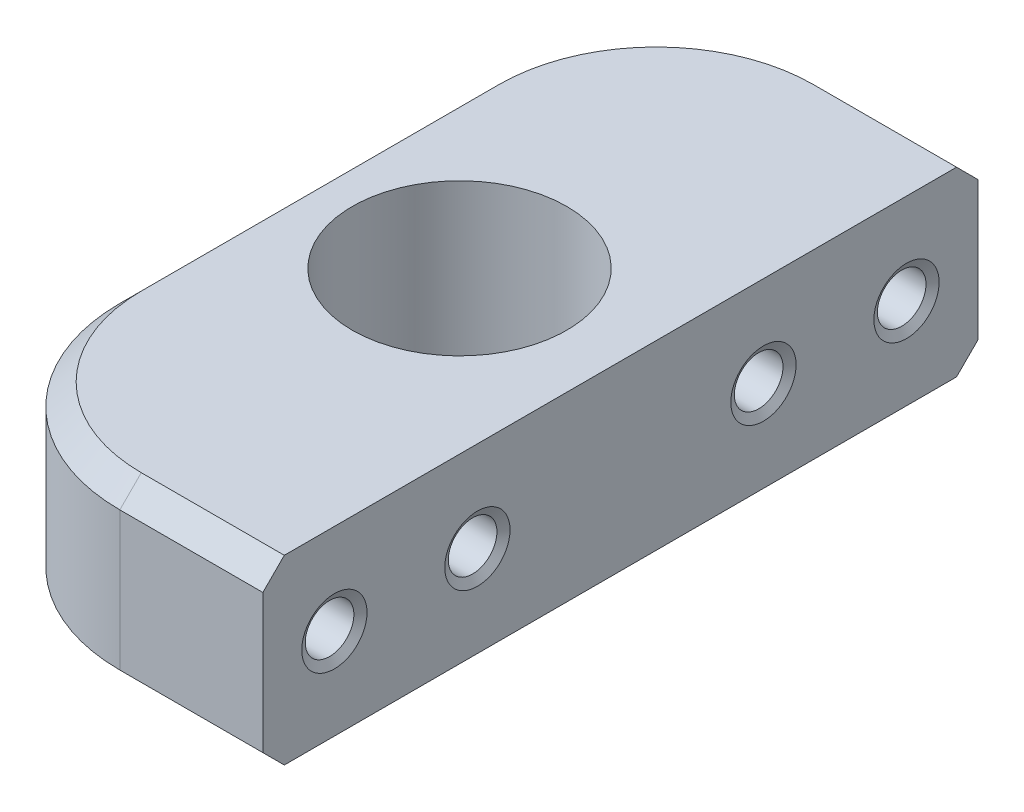
ISO-10303-21;
HEADER;
FILE_DESCRIPTION(('STEP AP214'),'2;1');
FILE_NAME('part.step','',(''),(''),'','','');
FILE_SCHEMA(('AUTOMOTIVE_DESIGN { 1 0 10303 214 1 1 1 1 }'));
ENDSEC;
DATA;
#1=APPLICATION_CONTEXT('core data for automotive mechanical design processes');
#2=APPLICATION_PROTOCOL_DEFINITION('international standard','automotive_design',2000,#1);
#3=PRODUCT_CONTEXT('',#1,'mechanical');
#4=PRODUCT('Part','Part','',(#3));
#5=PRODUCT_RELATED_PRODUCT_CATEGORY('part','',(#4));
#6=PRODUCT_DEFINITION_FORMATION('','',#4);
#7=PRODUCT_DEFINITION_CONTEXT('part definition',#1,'design');
#8=PRODUCT_DEFINITION('design','',#6,#7);
#9=PRODUCT_DEFINITION_SHAPE('','',#8);
#10=(LENGTH_UNIT() NAMED_UNIT(*) SI_UNIT(.MILLI.,.METRE.));
#11=(NAMED_UNIT(*) PLANE_ANGLE_UNIT() SI_UNIT($,.RADIAN.));
#12=(NAMED_UNIT(*) SI_UNIT($,.STERADIAN.) SOLID_ANGLE_UNIT());
#13=UNCERTAINTY_MEASURE_WITH_UNIT(LENGTH_MEASURE(1.E-05),#10,'distance_accuracy_value','');
#14=(GEOMETRIC_REPRESENTATION_CONTEXT(3) GLOBAL_UNCERTAINTY_ASSIGNED_CONTEXT((#13)) GLOBAL_UNIT_ASSIGNED_CONTEXT((#10,
#11,#12)) REPRESENTATION_CONTEXT('',''));
#15=CARTESIAN_POINT('',(0.,0.,0.));
#16=DIRECTION('',(0.,0.,1.));
#17=DIRECTION('',(1.,0.,0.));
#18=AXIS2_PLACEMENT_3D('',#15,#16,#17);
#19=CARTESIAN_POINT('',(475.51065238855,-36.9695033639549,-1030.48043119511));
#20=DIRECTION('',(1.,0.,0.));
#21=DIRECTION('',(0.,0.,-1.));
#22=AXIS2_PLACEMENT_3D('',#19,#20,#21);
#23=CONICAL_SURFACE('',#22,3.40000000001952,1.02974425863224);
#24=CARTESIAN_POINT('',(473.467726283786,-36.9695033640483,-1030.48043119511));
#25=VERTEX_POINT('',#24);
#26=VERTEX_LOOP('',#25);
#27=FACE_BOUND('',#26,.T.);
#28=CARTESIAN_POINT('',(475.510652388511,-36.9695033639549,-1030.48043119511));
#29=DIRECTION('',(1.,0.,0.));
#30=DIRECTION('',(0.,0.,-1.));
#31=AXIS2_PLACEMENT_3D('',#28,#29,#30);
#32=CIRCLE('',#31,3.4);
#33=CARTESIAN_POINT('',(475.510652388511,-36.9695033639549,-1033.88043119511));
#34=VERTEX_POINT('',#33);
#35=EDGE_CURVE('E84',#34,#34,#32,.T.);
#36=ORIENTED_EDGE('',*,*,#35,.T.);
#37=EDGE_LOOP('',(#36));
#38=FACE_BOUND('',#37,.T.);
#39=ADVANCED_FACE('F17',(#27,#38),#23,.F.);
#40=CARTESIAN_POINT('',(475.51065238855,-36.9695033639549,-950.480431195113));
#41=DIRECTION('',(1.,0.,0.));
#42=DIRECTION('',(0.,0.,-1.));
#43=AXIS2_PLACEMENT_3D('',#40,#41,#42);
#44=CONICAL_SURFACE('',#43,3.40000000001952,1.02974425863224);
#45=CARTESIAN_POINT('',(473.467726283786,-36.9695033640483,-950.480431195113));
#46=VERTEX_POINT('',#45);
#47=VERTEX_LOOP('',#46);
#48=FACE_BOUND('',#47,.T.);
#49=CARTESIAN_POINT('',(475.510652388511,-36.9695033639549,-950.480431195113));
#50=DIRECTION('',(1.,0.,0.));
#51=DIRECTION('',(0.,0.,-1.));
#52=AXIS2_PLACEMENT_3D('',#49,#50,#51);
#53=CIRCLE('',#52,3.4);
#54=CARTESIAN_POINT('',(475.510652388511,-36.9695033639549,-953.880431195113));
#55=VERTEX_POINT('',#54);
#56=EDGE_CURVE('E86',#55,#55,#53,.T.);
#57=ORIENTED_EDGE('',*,*,#56,.T.);
#58=EDGE_LOOP('',(#57));
#59=FACE_BOUND('',#58,.T.);
#60=ADVANCED_FACE('F81',(#48,#59),#44,.F.);
#61=CARTESIAN_POINT('',(475.51065238855,-36.9695033639549,-1010.48043119511));
#62=DIRECTION('',(1.,0.,0.));
#63=DIRECTION('',(0.,0.,-1.));
#64=AXIS2_PLACEMENT_3D('',#61,#62,#63);
#65=CONICAL_SURFACE('',#64,3.40000000001952,1.02974425863224);
#66=CARTESIAN_POINT('',(473.467726283786,-36.9695033640483,-1010.48043119511));
#67=VERTEX_POINT('',#66);
#68=VERTEX_LOOP('',#67);
#69=FACE_BOUND('',#68,.T.);
#70=CARTESIAN_POINT('',(475.510652388511,-36.9695033639549,-1010.48043119511));
#71=DIRECTION('',(1.,0.,0.));
#72=DIRECTION('',(0.,0.,-1.));
#73=AXIS2_PLACEMENT_3D('',#70,#71,#72);
#74=CIRCLE('',#73,3.4);
#75=CARTESIAN_POINT('',(475.510652388511,-36.9695033639549,-1013.88043119511));
#76=VERTEX_POINT('',#75);
#77=EDGE_CURVE('E89',#76,#76,#74,.T.);
#78=ORIENTED_EDGE('',*,*,#77,.T.);
#79=EDGE_LOOP('',(#78));
#80=FACE_BOUND('',#79,.T.);
#81=ADVANCED_FACE('F219',(#69,#80),#65,.F.);
#82=CARTESIAN_POINT('',(475.51065238855,-36.9695033639549,-970.480431195113));
#83=DIRECTION('',(1.,0.,0.));
#84=DIRECTION('',(0.,0.,-1.));
#85=AXIS2_PLACEMENT_3D('',#82,#83,#84);
#86=CONICAL_SURFACE('',#85,3.40000000001952,1.02974425863224);
#87=CARTESIAN_POINT('',(473.467726283786,-36.9695033640483,-970.480431195113));
#88=VERTEX_POINT('',#87);
#89=VERTEX_LOOP('',#88);
#90=FACE_BOUND('',#89,.T.);
#91=CARTESIAN_POINT('',(475.510652388511,-36.9695033639549,-970.480431195113));
#92=DIRECTION('',(1.,0.,0.));
#93=DIRECTION('',(0.,0.,-1.));
#94=AXIS2_PLACEMENT_3D('',#91,#92,#93);
#95=CIRCLE('',#94,3.4);
#96=CARTESIAN_POINT('',(475.510652388511,-36.9695033639549,-973.880431195113));
#97=VERTEX_POINT('',#96);
#98=EDGE_CURVE('E193',#97,#97,#95,.T.);
#99=ORIENTED_EDGE('',*,*,#98,.T.);
#100=EDGE_LOOP('',(#99));
#101=FACE_BOUND('',#100,.T.);
#102=ADVANCED_FACE('F491',(#90,#101),#86,.F.);
#103=CARTESIAN_POINT('',(499.010652388511,-36.9695033639549,-1030.48043119511));
#104=DIRECTION('',(1.,0.,0.));
#105=DIRECTION('',(0.,0.,-1.));
#106=AXIS2_PLACEMENT_3D('',#103,#104,#105);
#107=CYLINDRICAL_SURFACE('',#106,3.4);
#108=ORIENTED_EDGE('',*,*,#35,.F.);
#109=EDGE_LOOP('',(#108));
#110=FACE_BOUND('',#109,.T.);
#111=CARTESIAN_POINT('',(498.339482700601,-36.9695033639549,-1030.48043119511));
#112=DIRECTION('',(1.,0.,0.));
#113=DIRECTION('',(0.,1.,0.));
#114=AXIS2_PLACEMENT_3D('',#111,#112,#113);
#115=CIRCLE('',#114,3.40000000001952);
#116=CARTESIAN_POINT('',(498.339482700601,-33.5695033639354,-1030.48043119511));
#117=VERTEX_POINT('',#116);
#118=EDGE_CURVE('E187',#117,#117,#115,.T.);
#119=ORIENTED_EDGE('',*,*,#118,.T.);
#120=EDGE_LOOP('',(#119));
#121=FACE_BOUND('',#120,.T.);
#122=ADVANCED_FACE('F482',(#110,#121),#107,.F.);
#123=CARTESIAN_POINT('',(499.010652388511,-36.9695033639549,-950.480431195113));
#124=DIRECTION('',(1.,0.,0.));
#125=DIRECTION('',(0.,0.,-1.));
#126=AXIS2_PLACEMENT_3D('',#123,#124,#125);
#127=CYLINDRICAL_SURFACE('',#126,3.4);
#128=ORIENTED_EDGE('',*,*,#56,.F.);
#129=EDGE_LOOP('',(#128));
#130=FACE_BOUND('',#129,.T.);
#131=CARTESIAN_POINT('',(498.339482700601,-36.9695033639549,-950.480431195113));
#132=DIRECTION('',(1.,0.,0.));
#133=DIRECTION('',(0.,1.,0.));
#134=AXIS2_PLACEMENT_3D('',#131,#132,#133);
#135=CIRCLE('',#134,3.40000000001952);
#136=CARTESIAN_POINT('',(498.339482700601,-33.5695033639354,-950.480431195113));
#137=VERTEX_POINT('',#136);
#138=EDGE_CURVE('E210',#137,#137,#135,.T.);
#139=ORIENTED_EDGE('',*,*,#138,.T.);
#140=EDGE_LOOP('',(#139));
#141=FACE_BOUND('',#140,.T.);
#142=ADVANCED_FACE('F225',(#130,#141),#127,.F.);
#143=CARTESIAN_POINT('',(499.010652388511,-36.9695033639549,-1010.48043119511));
#144=DIRECTION('',(1.,0.,0.));
#145=DIRECTION('',(0.,0.,-1.));
#146=AXIS2_PLACEMENT_3D('',#143,#144,#145);
#147=CYLINDRICAL_SURFACE('',#146,3.4);
#148=ORIENTED_EDGE('',*,*,#77,.F.);
#149=EDGE_LOOP('',(#148));
#150=FACE_BOUND('',#149,.T.);
#151=CARTESIAN_POINT('',(498.339482700601,-36.9695033639549,-1010.48043119511));
#152=DIRECTION('',(1.,0.,0.));
#153=DIRECTION('',(0.,1.,0.));
#154=AXIS2_PLACEMENT_3D('',#151,#152,#153);
#155=CIRCLE('',#154,3.40000000001952);
#156=CARTESIAN_POINT('',(498.339482700601,-33.5695033639354,-1010.48043119511));
#157=VERTEX_POINT('',#156);
#158=EDGE_CURVE('E207',#157,#157,#155,.T.);
#159=ORIENTED_EDGE('',*,*,#158,.T.);
#160=EDGE_LOOP('',(#159));
#161=FACE_BOUND('',#160,.T.);
#162=ADVANCED_FACE('F221',(#150,#161),#147,.F.);
#163=CARTESIAN_POINT('',(499.010652388511,-36.9695033639549,-970.480431195113));
#164=DIRECTION('',(1.,0.,0.));
#165=DIRECTION('',(0.,0.,-1.));
#166=AXIS2_PLACEMENT_3D('',#163,#164,#165);
#167=CYLINDRICAL_SURFACE('',#166,3.4);
#168=ORIENTED_EDGE('',*,*,#98,.F.);
#169=EDGE_LOOP('',(#168));
#170=FACE_BOUND('',#169,.T.);
#171=CARTESIAN_POINT('',(498.339482700601,-36.9695033639549,-970.480431195113));
#172=DIRECTION('',(1.,0.,0.));
#173=DIRECTION('',(0.,1.,0.));
#174=AXIS2_PLACEMENT_3D('',#171,#172,#173);
#175=CIRCLE('',#174,3.40000000001952);
#176=CARTESIAN_POINT('',(498.339482700601,-33.5695033639354,-970.480431195113));
#177=VERTEX_POINT('',#176);
#178=EDGE_CURVE('E170',#177,#177,#175,.T.);
#179=ORIENTED_EDGE('',*,*,#178,.T.);
#180=EDGE_LOOP('',(#179));
#181=FACE_BOUND('',#180,.T.);
#182=ADVANCED_FACE('F224',(#170,#181),#167,.F.);
#183=CARTESIAN_POINT('',(479.010652388512,-46.6695033639548,-1015.48043119511));
#184=DIRECTION('',(0.,1.,0.));
#185=DIRECTION('',(0.,0.,1.));
#186=AXIS2_PLACEMENT_3D('',#183,#184,#185);
#187=CONICAL_SURFACE('',#186,24.9999999999999,0.785398163397432);
#188=CARTESIAN_POINT('',(479.010652388512,-49.6695033639549,-1015.48043119511));
#189=DIRECTION('',(0.,1.,0.));
#190=DIRECTION('',(0.,0.,1.));
#191=AXIS2_PLACEMENT_3D('',#188,#189,#190);
#192=CIRCLE('',#191,22.);
#193=CARTESIAN_POINT('',(457.010652388512,-49.6695033639549,-1015.48043119511));
#194=VERTEX_POINT('',#193);
#195=CARTESIAN_POINT('',(479.010652388512,-49.6695033639549,-1037.48043119511));
#196=VERTEX_POINT('',#195);
#197=EDGE_CURVE('E121',#194,#196,#192,.F.);
#198=ORIENTED_EDGE('',*,*,#197,.F.);
#199=DIRECTION('',(-0.707106781186548,0.707106781186548,0.));
#200=VECTOR('',#199,1.);
#201=CARTESIAN_POINT('',(455.510652388512,-48.1695033639549,-1015.48043119511));
#202=LINE('',#201,#200);
#203=CARTESIAN_POINT('',(454.010652388512,-46.6695033639549,-1015.48043119511));
#204=VERTEX_POINT('',#203);
#205=EDGE_CURVE('E188',#194,#204,#202,.T.);
#206=ORIENTED_EDGE('',*,*,#205,.T.);
#207=CARTESIAN_POINT('',(479.010652388512,-46.6695033639549,-1015.48043119511));
#208=DIRECTION('',(0.,-1.,0.));
#209=DIRECTION('',(0.,0.,-1.));
#210=AXIS2_PLACEMENT_3D('',#207,#208,#209);
#211=CIRCLE('',#210,25.);
#212=CARTESIAN_POINT('',(479.010652388512,-46.6695033639549,-1040.48043119511));
#213=VERTEX_POINT('',#212);
#214=EDGE_CURVE('E145',#213,#204,#211,.F.);
#215=ORIENTED_EDGE('',*,*,#214,.F.);
#216=DIRECTION('',(0.,0.707106781186548,-0.707106781186548));
#217=VECTOR('',#216,1.);
#218=CARTESIAN_POINT('',(479.010652388512,-48.1695033639549,-1038.98043119511));
#219=LINE('',#218,#217);
#220=EDGE_CURVE('E140',#196,#213,#219,.T.);
#221=ORIENTED_EDGE('',*,*,#220,.F.);
#222=EDGE_LOOP('',(#198,#206,#215,#221));
#223=FACE_BOUND('',#222,.T.);
#224=ADVANCED_FACE('F452',(#223),#187,.T.);
#225=CARTESIAN_POINT('',(455.510652388512,-48.1695033639549,-990.480431195112));
#226=DIRECTION('',(0.707106781186548,0.707106781186548,0.));
#227=DIRECTION('',(-0.707106781186548,0.707106781186548,0.));
#228=AXIS2_PLACEMENT_3D('',#225,#226,#227);
#229=PLANE('',#228);
#230=ORIENTED_EDGE('',*,*,#205,.F.);
#231=DIRECTION('',(0.,0.,-1.));
#232=VECTOR('',#231,1.);
#233=CARTESIAN_POINT('',(457.010652388512,-49.6695033639549,-1040.48043119511));
#234=LINE('',#233,#232);
#235=CARTESIAN_POINT('',(457.010652388512,-49.6695033639549,-965.480431195113));
#236=VERTEX_POINT('',#235);
#237=EDGE_CURVE('E124',#236,#194,#234,.T.);
#238=ORIENTED_EDGE('',*,*,#237,.F.);
#239=DIRECTION('',(0.707106781186548,-0.707106781186547,0.));
#240=VECTOR('',#239,1.);
#241=CARTESIAN_POINT('',(454.010652388512,-46.6695033639549,-965.480431195113));
#242=LINE('',#241,#240);
#243=CARTESIAN_POINT('',(454.010652388512,-46.6695033639549,-965.480431195113));
#244=VERTEX_POINT('',#243);
#245=EDGE_CURVE('E185',#244,#236,#242,.T.);
#246=ORIENTED_EDGE('',*,*,#245,.F.);
#247=DIRECTION('',(0.,0.,-1.));
#248=VECTOR('',#247,1.);
#249=CARTESIAN_POINT('',(454.010652388512,-46.6695033639549,-1060.48043119511));
#250=LINE('',#249,#248);
#251=EDGE_CURVE('E177',#244,#204,#250,.T.);
#252=ORIENTED_EDGE('',*,*,#251,.T.);
#253=EDGE_LOOP('',(#230,#238,#246,#252));
#254=FACE_BOUND('',#253,.T.);
#255=ADVANCED_FACE('F443',(#254),#229,.F.);
#256=CARTESIAN_POINT('',(479.010652388512,-46.6695033639549,-965.480431195113));
#257=DIRECTION('',(0.,1.,0.));
#258=DIRECTION('',(-1.,0.,0.));
#259=AXIS2_PLACEMENT_3D('',#256,#257,#258);
#260=CONICAL_SURFACE('',#259,25.,0.785398163397452);
#261=CARTESIAN_POINT('',(479.010652388512,-49.6695033639549,-965.480431195113));
#262=DIRECTION('',(0.,1.,0.));
#263=DIRECTION('',(-1.,0.,0.));
#264=AXIS2_PLACEMENT_3D('',#261,#262,#263);
#265=CIRCLE('',#264,22.);
#266=CARTESIAN_POINT('',(479.010652388512,-49.6695033639549,-943.480431195113));
#267=VERTEX_POINT('',#266);
#268=EDGE_CURVE('E20',#267,#236,#265,.F.);
#269=ORIENTED_EDGE('',*,*,#268,.F.);
#270=DIRECTION('',(0.,0.707106781186548,0.707106781186548));
#271=VECTOR('',#270,1.);
#272=CARTESIAN_POINT('',(479.010652388512,-48.1695033639549,-941.980431195113));
#273=LINE('',#272,#271);
#274=CARTESIAN_POINT('',(479.010652388512,-46.6695033639549,-940.480431195113));
#275=VERTEX_POINT('',#274);
#276=EDGE_CURVE('E61',#267,#275,#273,.T.);
#277=ORIENTED_EDGE('',*,*,#276,.T.);
#278=CARTESIAN_POINT('',(479.010652388512,-46.6695033639549,-965.480431195113));
#279=DIRECTION('',(0.,-1.,0.));
#280=DIRECTION('',(0.,0.,-1.));
#281=AXIS2_PLACEMENT_3D('',#278,#279,#280);
#282=CIRCLE('',#281,25.);
#283=EDGE_CURVE('E173',#244,#275,#282,.F.);
#284=ORIENTED_EDGE('',*,*,#283,.F.);
#285=ORIENTED_EDGE('',*,*,#245,.T.);
#286=EDGE_LOOP('',(#269,#277,#284,#285));
#287=FACE_BOUND('',#286,.T.);
#288=ADVANCED_FACE('F434',(#287),#260,.T.);
#289=CARTESIAN_POINT('',(499.010652388563,-36.9695033639549,-1030.48043119511));
#290=DIRECTION('',(1.,0.,0.));
#291=DIRECTION('',(0.,0.,-1.));
#292=AXIS2_PLACEMENT_3D('',#289,#290,#291);
#293=CONICAL_SURFACE('',#292,4.56250000009719,1.04719755120111);
#294=CARTESIAN_POINT('',(499.010652388486,-36.9695033639549,-1030.48043119511));
#295=DIRECTION('',(1.,0.,0.));
#296=DIRECTION('',(0.,0.,-1.));
#297=AXIS2_PLACEMENT_3D('',#294,#295,#296);
#298=CIRCLE('',#297,4.56249999996317);
#299=CARTESIAN_POINT('',(499.010652388486,-36.9695033639549,-1035.04293119507));
#300=VERTEX_POINT('',#299);
#301=EDGE_CURVE('E115',#300,#300,#298,.T.);
#302=ORIENTED_EDGE('',*,*,#301,.T.);
#303=EDGE_LOOP('',(#302));
#304=FACE_BOUND('',#303,.T.);
#305=ORIENTED_EDGE('',*,*,#118,.F.);
#306=EDGE_LOOP('',(#305));
#307=FACE_BOUND('',#306,.T.);
#308=ADVANCED_FACE('F243',(#304,#307),#293,.F.);
#309=CARTESIAN_POINT('',(499.010652388563,-36.9695033639549,-950.480431195113));
#310=DIRECTION('',(1.,0.,0.));
#311=DIRECTION('',(0.,0.,-1.));
#312=AXIS2_PLACEMENT_3D('',#309,#310,#311);
#313=CONICAL_SURFACE('',#312,4.56250000009719,1.04719755120111);
#314=CARTESIAN_POINT('',(499.010652388486,-36.9695033639549,-950.480431195113));
#315=DIRECTION('',(1.,0.,0.));
#316=DIRECTION('',(0.,0.,-1.));
#317=AXIS2_PLACEMENT_3D('',#314,#315,#316);
#318=CIRCLE('',#317,4.56249999996317);
#319=CARTESIAN_POINT('',(499.010652388486,-36.9695033639549,-955.042931195076));
#320=VERTEX_POINT('',#319);
#321=EDGE_CURVE('E112',#320,#320,#318,.T.);
#322=ORIENTED_EDGE('',*,*,#321,.T.);
#323=EDGE_LOOP('',(#322));
#324=FACE_BOUND('',#323,.T.);
#325=ORIENTED_EDGE('',*,*,#138,.F.);
#326=EDGE_LOOP('',(#325));
#327=FACE_BOUND('',#326,.T.);
#328=ADVANCED_FACE('F232',(#324,#327),#313,.F.);
#329=CARTESIAN_POINT('',(499.010652388563,-36.9695033639549,-1010.48043119511));
#330=DIRECTION('',(1.,0.,0.));
#331=DIRECTION('',(0.,0.,-1.));
#332=AXIS2_PLACEMENT_3D('',#329,#330,#331);
#333=CONICAL_SURFACE('',#332,4.56250000009719,1.04719755120111);
#334=CARTESIAN_POINT('',(499.010652388486,-36.9695033639549,-1010.48043119511));
#335=DIRECTION('',(1.,0.,0.));
#336=DIRECTION('',(0.,0.,-1.));
#337=AXIS2_PLACEMENT_3D('',#334,#335,#336);
#338=CIRCLE('',#337,4.56249999996317);
#339=CARTESIAN_POINT('',(499.010652388486,-36.9695033639549,-1015.04293119507));
#340=VERTEX_POINT('',#339);
#341=EDGE_CURVE('E109',#340,#340,#338,.T.);
#342=ORIENTED_EDGE('',*,*,#341,.T.);
#343=EDGE_LOOP('',(#342));
#344=FACE_BOUND('',#343,.T.);
#345=ORIENTED_EDGE('',*,*,#158,.F.);
#346=EDGE_LOOP('',(#345));
#347=FACE_BOUND('',#346,.T.);
#348=ADVANCED_FACE('F229',(#344,#347),#333,.F.);
#349=CARTESIAN_POINT('',(499.010652388563,-36.9695033639549,-970.480431195113));
#350=DIRECTION('',(1.,0.,0.));
#351=DIRECTION('',(0.,0.,-1.));
#352=AXIS2_PLACEMENT_3D('',#349,#350,#351);
#353=CONICAL_SURFACE('',#352,4.56250000009719,1.04719755120111);
#354=CARTESIAN_POINT('',(499.010652388486,-36.9695033639549,-970.480431195113));
#355=DIRECTION('',(1.,0.,0.));
#356=DIRECTION('',(0.,0.,-1.));
#357=AXIS2_PLACEMENT_3D('',#354,#355,#356);
#358=CIRCLE('',#357,4.56249999996317);
#359=CARTESIAN_POINT('',(499.010652388486,-36.9695033639549,-975.042931195076));
#360=VERTEX_POINT('',#359);
#361=EDGE_CURVE('E105',#360,#360,#358,.T.);
#362=ORIENTED_EDGE('',*,*,#361,.T.);
#363=EDGE_LOOP('',(#362));
#364=FACE_BOUND('',#363,.T.);
#365=ORIENTED_EDGE('',*,*,#178,.F.);
#366=EDGE_LOOP('',(#365));
#367=FACE_BOUND('',#366,.T.);
#368=ADVANCED_FACE('F231',(#364,#367),#353,.F.);
#369=CARTESIAN_POINT('',(489.010652388512,-48.1695033639549,-941.980431195113));
#370=DIRECTION('',(0.,0.707106781186548,-0.707106781186548));
#371=DIRECTION('',(0.,0.707106781186548,0.707106781186548));
#372=AXIS2_PLACEMENT_3D('',#369,#370,#371);
#373=PLANE('',#372);
#374=ORIENTED_EDGE('',*,*,#276,.F.);
#375=DIRECTION('',(1.,0.,0.));
#376=VECTOR('',#375,1.);
#377=CARTESIAN_POINT('',(489.010652388511,-49.6695033639549,-943.480431195113));
#378=LINE('',#377,#376);
#379=CARTESIAN_POINT('',(499.010652388511,-49.6695033639549,-943.480431195113));
#380=VERTEX_POINT('',#379);
#381=EDGE_CURVE('E134',#380,#267,#378,.F.);
#382=ORIENTED_EDGE('',*,*,#381,.F.);
#383=DIRECTION('',(0.,0.707106781186547,0.707106781186547));
#384=VECTOR('',#383,1.);
#385=CARTESIAN_POINT('',(499.010652388511,-49.6695033639549,-943.480431195113));
#386=LINE('',#385,#384);
#387=CARTESIAN_POINT('',(499.010652388511,-46.6695033639549,-940.480431195113));
#388=VERTEX_POINT('',#387);
#389=EDGE_CURVE('E108',#380,#388,#386,.T.);
#390=ORIENTED_EDGE('',*,*,#389,.T.);
#391=DIRECTION('',(-1.,0.,0.));
#392=VECTOR('',#391,1.);
#393=CARTESIAN_POINT('',(489.010652388511,-46.6695033639549,-940.480431195113));
#394=LINE('',#393,#392);
#395=EDGE_CURVE('E120',#388,#275,#394,.T.);
#396=ORIENTED_EDGE('',*,*,#395,.T.);
#397=EDGE_LOOP('',(#374,#382,#390,#396));
#398=FACE_BOUND('',#397,.T.);
#399=ADVANCED_FACE('F240',(#398),#373,.F.);
#400=CARTESIAN_POINT('',(489.010652388512,-48.1695033639549,-1038.98043119511));
#401=DIRECTION('',(0.,-0.707106781186548,-0.707106781186548));
#402=DIRECTION('',(0.,0.707106781186548,-0.707106781186548));
#403=AXIS2_PLACEMENT_3D('',#400,#401,#402);
#404=PLANE('',#403);
#405=DIRECTION('',(1.,0.,0.));
#406=VECTOR('',#405,1.);
#407=CARTESIAN_POINT('',(489.010652388511,-49.6695033639549,-1037.48043119511));
#408=LINE('',#407,#406);
#409=CARTESIAN_POINT('',(499.010652388511,-49.6695033639549,-1037.48043119511));
#410=VERTEX_POINT('',#409);
#411=EDGE_CURVE('E123',#196,#410,#408,.T.);
#412=ORIENTED_EDGE('',*,*,#411,.F.);
#413=ORIENTED_EDGE('',*,*,#220,.T.);
#414=DIRECTION('',(-1.,0.,0.));
#415=VECTOR('',#414,1.);
#416=CARTESIAN_POINT('',(489.010652388511,-46.6695033639549,-1040.48043119511));
#417=LINE('',#416,#415);
#418=CARTESIAN_POINT('',(499.010652388511,-46.6695033639549,-1040.48043119511));
#419=VERTEX_POINT('',#418);
#420=EDGE_CURVE('E129',#419,#213,#417,.T.);
#421=ORIENTED_EDGE('',*,*,#420,.F.);
#422=DIRECTION('',(0.,-0.707106781186561,0.707106781186534));
#423=VECTOR('',#422,1.);
#424=CARTESIAN_POINT('',(499.010652388511,-46.6695033639549,-1040.48043119511));
#425=LINE('',#424,#423);
#426=EDGE_CURVE('E148',#419,#410,#425,.T.);
#427=ORIENTED_EDGE('',*,*,#426,.T.);
#428=EDGE_LOOP('',(#412,#413,#421,#427));
#429=FACE_BOUND('',#428,.T.);
#430=ADVANCED_FACE('F304',(#429),#404,.T.);
#431=CARTESIAN_POINT('',(489.010652388511,-49.6695033639549,-1040.48043119511));
#432=DIRECTION('',(0.,-1.,0.));
#433=DIRECTION('',(0.,0.,-1.));
#434=AXIS2_PLACEMENT_3D('',#431,#432,#433);
#435=PLANE('',#434);
#436=ORIENTED_EDGE('',*,*,#411,.T.);
#437=DIRECTION('',(0.,0.,1.));
#438=VECTOR('',#437,1.);
#439=CARTESIAN_POINT('',(499.010652388511,-49.6695033639549,-1060.48043119511));
#440=LINE('',#439,#438);
#441=EDGE_CURVE('E151',#410,#380,#440,.T.);
#442=ORIENTED_EDGE('',*,*,#441,.T.);
#443=ORIENTED_EDGE('',*,*,#381,.T.);
#444=ORIENTED_EDGE('',*,*,#268,.T.);
#445=ORIENTED_EDGE('',*,*,#237,.T.);
#446=ORIENTED_EDGE('',*,*,#197,.T.);
#447=EDGE_LOOP('',(#436,#442,#443,#444,#445,#446));
#448=FACE_BOUND('',#447,.T.);
#449=CARTESIAN_POINT('',(476.510652388511,-49.6695033639549,-990.480431195113));
#450=DIRECTION('',(0.,-1.,0.));
#451=DIRECTION('',(0.,0.,-1.));
#452=AXIS2_PLACEMENT_3D('',#449,#450,#451);
#453=CIRCLE('',#452,15.);
#454=CARTESIAN_POINT('',(476.510652388511,-49.6695033639549,-1005.48043119511));
#455=VERTEX_POINT('',#454);
#456=EDGE_CURVE('E118',#455,#455,#453,.F.);
#457=ORIENTED_EDGE('',*,*,#456,.T.);
#458=EDGE_LOOP('',(#457));
#459=FACE_BOUND('',#458,.T.);
#460=ADVANCED_FACE('F300',(#448,#459),#435,.T.);
#461=CARTESIAN_POINT('',(489.010652388511,-24.2695033639549,-1040.48043119511));
#462=DIRECTION('',(0.,0.,-1.));
#463=DIRECTION('',(-1.,0.,0.));
#464=AXIS2_PLACEMENT_3D('',#461,#462,#463);
#465=PLANE('',#464);
#466=DIRECTION('',(1.,0.,0.));
#467=VECTOR('',#466,1.);
#468=CARTESIAN_POINT('',(489.010652388512,-27.2695033639548,-1040.48043119511));
#469=LINE('',#468,#467);
#470=CARTESIAN_POINT('',(499.010652388511,-27.2695033639548,-1040.48043119511));
#471=VERTEX_POINT('',#470);
#472=CARTESIAN_POINT('',(479.010652388512,-27.2695033639549,-1040.48043119511));
#473=VERTEX_POINT('',#472);
#474=EDGE_CURVE('E166',#471,#473,#469,.F.);
#475=ORIENTED_EDGE('',*,*,#474,.F.);
#476=DIRECTION('',(0.,1.,0.));
#477=VECTOR('',#476,1.);
#478=CARTESIAN_POINT('',(499.010652388511,-49.6695033639549,-1040.48043119511));
#479=LINE('',#478,#477);
#480=EDGE_CURVE('E152',#471,#419,#479,.F.);
#481=ORIENTED_EDGE('',*,*,#480,.T.);
#482=ORIENTED_EDGE('',*,*,#420,.T.);
#483=DIRECTION('',(0.,-1.,0.));
#484=VECTOR('',#483,1.);
#485=CARTESIAN_POINT('',(479.010652388512,-26.1195033639549,-1040.48043119511));
#486=LINE('',#485,#484);
#487=EDGE_CURVE('E198',#473,#213,#486,.T.);
#488=ORIENTED_EDGE('',*,*,#487,.F.);
#489=EDGE_LOOP('',(#475,#481,#482,#488));
#490=FACE_BOUND('',#489,.T.);
#491=ADVANCED_FACE('F296',(#490),#465,.T.);
#492=CARTESIAN_POINT('',(479.010652388512,-26.1195033639549,-1015.48043119511));
#493=DIRECTION('',(0.,-1.,0.));
#494=DIRECTION('',(0.,0.,-1.));
#495=AXIS2_PLACEMENT_3D('',#492,#493,#494);
#496=CYLINDRICAL_SURFACE('',#495,25.);
#497=CARTESIAN_POINT('',(479.010652388512,-27.2695033639549,-1015.48043119511));
#498=DIRECTION('',(0.,-1.,0.));
#499=DIRECTION('',(0.,0.,1.));
#500=AXIS2_PLACEMENT_3D('',#497,#498,#499);
#501=CIRCLE('',#500,25.);
#502=CARTESIAN_POINT('',(454.010652388512,-27.2695033639549,-1015.48043119511));
#503=VERTEX_POINT('',#502);
#504=EDGE_CURVE('E599',#473,#503,#501,.F.);
#505=ORIENTED_EDGE('',*,*,#504,.F.);
#506=ORIENTED_EDGE('',*,*,#487,.T.);
#507=ORIENTED_EDGE('',*,*,#214,.T.);
#508=DIRECTION('',(0.,1.,0.));
#509=VECTOR('',#508,1.);
#510=CARTESIAN_POINT('',(454.010652388512,-24.2695033639549,-1015.48043119511));
#511=LINE('',#510,#509);
#512=EDGE_CURVE('E182',#204,#503,#511,.T.);
#513=ORIENTED_EDGE('',*,*,#512,.T.);
#514=EDGE_LOOP('',(#505,#506,#507,#513));
#515=FACE_BOUND('',#514,.T.);
#516=ADVANCED_FACE('F292',(#515),#496,.T.);
#517=CARTESIAN_POINT('',(454.010652388512,-24.2695033639549,-1060.48043119511));
#518=DIRECTION('',(1.,0.,0.));
#519=DIRECTION('',(0.,0.,-1.));
#520=AXIS2_PLACEMENT_3D('',#517,#518,#519);
#521=PLANE('',#520);
#522=DIRECTION('',(0.,-1.,0.));
#523=VECTOR('',#522,1.);
#524=CARTESIAN_POINT('',(454.010652388512,-26.1195033639549,-965.480431195113));
#525=LINE('',#524,#523);
#526=CARTESIAN_POINT('',(454.010652388512,-27.2695033639549,-965.480431195113));
#527=VERTEX_POINT('',#526);
#528=EDGE_CURVE('E176',#527,#244,#525,.T.);
#529=ORIENTED_EDGE('',*,*,#528,.F.);
#530=DIRECTION('',(0.,0.,1.));
#531=VECTOR('',#530,1.);
#532=CARTESIAN_POINT('',(454.010652388512,-27.2695033639549,-990.480431195112));
#533=LINE('',#532,#531);
#534=EDGE_CURVE('E586',#527,#503,#533,.F.);
#535=ORIENTED_EDGE('',*,*,#534,.T.);
#536=ORIENTED_EDGE('',*,*,#512,.F.);
#537=ORIENTED_EDGE('',*,*,#251,.F.);
#538=EDGE_LOOP('',(#529,#535,#536,#537));
#539=FACE_BOUND('',#538,.T.);
#540=ADVANCED_FACE('F288',(#539),#521,.F.);
#541=CARTESIAN_POINT('',(479.010652388512,-26.1195033639549,-965.480431195113));
#542=DIRECTION('',(0.,-1.,0.));
#543=DIRECTION('',(0.,0.,-1.));
#544=AXIS2_PLACEMENT_3D('',#541,#542,#543);
#545=CYLINDRICAL_SURFACE('',#544,25.);
#546=CARTESIAN_POINT('',(479.010652388512,-27.2695033639549,-965.480431195113));
#547=DIRECTION('',(0.,-1.,0.));
#548=DIRECTION('',(0.,0.,1.));
#549=AXIS2_PLACEMENT_3D('',#546,#547,#548);
#550=CIRCLE('',#549,25.);
#551=CARTESIAN_POINT('',(479.010652388512,-27.2695033639549,-940.480431195113));
#552=VERTEX_POINT('',#551);
#553=EDGE_CURVE('E589',#527,#552,#550,.F.);
#554=ORIENTED_EDGE('',*,*,#553,.F.);
#555=ORIENTED_EDGE('',*,*,#528,.T.);
#556=ORIENTED_EDGE('',*,*,#283,.T.);
#557=DIRECTION('',(0.,1.,0.));
#558=VECTOR('',#557,1.);
#559=CARTESIAN_POINT('',(479.010652388512,-24.2695033639549,-940.480431195113));
#560=LINE('',#559,#558);
#561=EDGE_CURVE('E156',#275,#552,#560,.T.);
#562=ORIENTED_EDGE('',*,*,#561,.T.);
#563=EDGE_LOOP('',(#554,#555,#556,#562));
#564=FACE_BOUND('',#563,.T.);
#565=ADVANCED_FACE('F284',(#564),#545,.T.);
#566=CARTESIAN_POINT('',(489.010652388511,-24.2695033639549,-940.480431195113));
#567=DIRECTION('',(0.,0.,-1.));
#568=DIRECTION('',(-1.,0.,0.));
#569=AXIS2_PLACEMENT_3D('',#566,#567,#568);
#570=PLANE('',#569);
#571=DIRECTION('',(0.,1.,0.));
#572=VECTOR('',#571,1.);
#573=CARTESIAN_POINT('',(499.010652388511,-49.6695033639549,-940.480431195113));
#574=LINE('',#573,#572);
#575=CARTESIAN_POINT('',(499.010652388511,-27.269503363955,-940.480431195113));
#576=VERTEX_POINT('',#575);
#577=EDGE_CURVE('E161',#388,#576,#574,.T.);
#578=ORIENTED_EDGE('',*,*,#577,.T.);
#579=DIRECTION('',(1.,0.,0.));
#580=VECTOR('',#579,1.);
#581=CARTESIAN_POINT('',(489.010652388512,-27.2695033639549,-940.480431195113));
#582=LINE('',#581,#580);
#583=EDGE_CURVE('E104',#576,#552,#582,.F.);
#584=ORIENTED_EDGE('',*,*,#583,.T.);
#585=ORIENTED_EDGE('',*,*,#561,.F.);
#586=ORIENTED_EDGE('',*,*,#395,.F.);
#587=EDGE_LOOP('',(#578,#584,#585,#586));
#588=FACE_BOUND('',#587,.T.);
#589=ADVANCED_FACE('F280',(#588),#570,.F.);
#590=CARTESIAN_POINT('',(476.510652388511,-49.6695033639549,-990.480431195113));
#591=DIRECTION('',(0.,-1.,0.));
#592=DIRECTION('',(0.,0.,-1.));
#593=AXIS2_PLACEMENT_3D('',#590,#591,#592);
#594=CYLINDRICAL_SURFACE('',#593,15.);
#595=CARTESIAN_POINT('',(476.510652388511,-24.2695033639549,-990.480431195113));
#596=DIRECTION('',(0.,-1.,0.));
#597=DIRECTION('',(0.,0.,-1.));
#598=AXIS2_PLACEMENT_3D('',#595,#596,#597);
#599=CIRCLE('',#598,15.);
#600=CARTESIAN_POINT('',(476.510652388511,-24.2695033639549,-1005.48043119511));
#601=VERTEX_POINT('',#600);
#602=EDGE_CURVE('E100',#601,#601,#599,.T.);
#603=ORIENTED_EDGE('',*,*,#602,.F.);
#604=EDGE_LOOP('',(#603));
#605=FACE_BOUND('',#604,.T.);
#606=ORIENTED_EDGE('',*,*,#456,.F.);
#607=EDGE_LOOP('',(#606));
#608=FACE_BOUND('',#607,.T.);
#609=ADVANCED_FACE('F276',(#605,#608),#594,.F.);
#610=CARTESIAN_POINT('',(499.010652388511,-49.6695033639549,-1060.48043119511));
#611=DIRECTION('',(-1.,0.,0.));
#612=DIRECTION('',(0.,0.,1.));
#613=AXIS2_PLACEMENT_3D('',#610,#611,#612);
#614=PLANE('',#613);
#615=ORIENTED_EDGE('',*,*,#426,.F.);
#616=ORIENTED_EDGE('',*,*,#480,.F.);
#617=DIRECTION('',(0.,0.707106781186548,0.707106781186548));
#618=VECTOR('',#617,1.);
#619=CARTESIAN_POINT('',(499.010652388511,-25.7695033639549,-1038.98043119511));
#620=LINE('',#619,#618);
#621=CARTESIAN_POINT('',(499.010652388511,-24.2695033639549,-1037.48043119511));
#622=VERTEX_POINT('',#621);
#623=EDGE_CURVE('E603',#622,#471,#620,.F.);
#624=ORIENTED_EDGE('',*,*,#623,.F.);
#625=DIRECTION('',(0.,0.,1.));
#626=VECTOR('',#625,1.);
#627=CARTESIAN_POINT('',(499.010652388511,-24.2695033639549,-965.480431195113));
#628=LINE('',#627,#626);
#629=CARTESIAN_POINT('',(499.010652388511,-24.2695033639549,-943.480431195113));
#630=VERTEX_POINT('',#629);
#631=EDGE_CURVE('E103',#630,#622,#628,.F.);
#632=ORIENTED_EDGE('',*,*,#631,.F.);
#633=DIRECTION('',(0.,0.707106781186548,-0.707106781186548));
#634=VECTOR('',#633,1.);
#635=CARTESIAN_POINT('',(499.010652388511,-25.7695033639549,-941.980431195113));
#636=LINE('',#635,#634);
#637=EDGE_CURVE('E626',#630,#576,#636,.F.);
#638=ORIENTED_EDGE('',*,*,#637,.T.);
#639=ORIENTED_EDGE('',*,*,#577,.F.);
#640=ORIENTED_EDGE('',*,*,#389,.F.);
#641=ORIENTED_EDGE('',*,*,#441,.F.);
#642=EDGE_LOOP('',(#615,#616,#624,#632,#638,#639,#640,#641));
#643=FACE_BOUND('',#642,.T.);
#644=ORIENTED_EDGE('',*,*,#361,.F.);
#645=EDGE_LOOP('',(#644));
#646=FACE_BOUND('',#645,.T.);
#647=ORIENTED_EDGE('',*,*,#341,.F.);
#648=EDGE_LOOP('',(#647));
#649=FACE_BOUND('',#648,.T.);
#650=ORIENTED_EDGE('',*,*,#321,.F.);
#651=EDGE_LOOP('',(#650));
#652=FACE_BOUND('',#651,.T.);
#653=ORIENTED_EDGE('',*,*,#301,.F.);
#654=EDGE_LOOP('',(#653));
#655=FACE_BOUND('',#654,.T.);
#656=ADVANCED_FACE('F272',(#643,#646,#649,#652,#655),#614,.F.);
#657=CARTESIAN_POINT('',(489.010652388512,-25.7695033639549,-1038.98043119511));
#658=DIRECTION('',(0.,0.707106781186548,-0.707106781186548));
#659=DIRECTION('',(0.,0.707106781186548,0.707106781186548));
#660=AXIS2_PLACEMENT_3D('',#657,#658,#659);
#661=PLANE('',#660);
#662=DIRECTION('',(1.,0.,0.));
#663=VECTOR('',#662,1.);
#664=CARTESIAN_POINT('',(489.010652388511,-24.2695033639549,-1037.48043119511));
#665=LINE('',#664,#663);
#666=CARTESIAN_POINT('',(479.010652388512,-24.2695033639549,-1037.48043119511));
#667=VERTEX_POINT('',#666);
#668=EDGE_CURVE('E99',#622,#667,#665,.F.);
#669=ORIENTED_EDGE('',*,*,#668,.F.);
#670=ORIENTED_EDGE('',*,*,#623,.T.);
#671=ORIENTED_EDGE('',*,*,#474,.T.);
#672=DIRECTION('',(0.,0.707106781186548,0.707106781186548));
#673=VECTOR('',#672,1.);
#674=CARTESIAN_POINT('',(479.010652388512,-27.2695033639549,-1040.48043119511));
#675=LINE('',#674,#673);
#676=EDGE_CURVE('E602',#667,#473,#675,.F.);
#677=ORIENTED_EDGE('',*,*,#676,.F.);
#678=EDGE_LOOP('',(#669,#670,#671,#677));
#679=FACE_BOUND('',#678,.T.);
#680=ADVANCED_FACE('F268',(#679),#661,.T.);
#681=CARTESIAN_POINT('',(479.010652388512,-27.2695033639549,-1015.48043119511));
#682=DIRECTION('',(0.,-1.,0.));
#683=DIRECTION('',(0.,0.,-1.));
#684=AXIS2_PLACEMENT_3D('',#681,#682,#683);
#685=CONICAL_SURFACE('',#684,25.,0.785398163397452);
#686=CARTESIAN_POINT('',(479.010652388512,-24.2695033639549,-1015.48043119511));
#687=DIRECTION('',(0.,-1.,0.));
#688=DIRECTION('',(0.,0.,-1.));
#689=AXIS2_PLACEMENT_3D('',#686,#687,#688);
#690=CIRCLE('',#689,22.);
#691=CARTESIAN_POINT('',(457.010652388512,-24.2695033639549,-1015.48043119511));
#692=VERTEX_POINT('',#691);
#693=EDGE_CURVE('E96',#667,#692,#690,.F.);
#694=ORIENTED_EDGE('',*,*,#693,.F.);
#695=ORIENTED_EDGE('',*,*,#676,.T.);
#696=ORIENTED_EDGE('',*,*,#504,.T.);
#697=DIRECTION('',(0.707106781186548,0.707106781186548,0.));
#698=VECTOR('',#697,1.);
#699=CARTESIAN_POINT('',(455.510652388512,-25.7695033639549,-1015.48043119511));
#700=LINE('',#699,#698);
#701=EDGE_CURVE('E590',#503,#692,#700,.T.);
#702=ORIENTED_EDGE('',*,*,#701,.T.);
#703=EDGE_LOOP('',(#694,#695,#696,#702));
#704=FACE_BOUND('',#703,.T.);
#705=ADVANCED_FACE('F264',(#704),#685,.T.);
#706=CARTESIAN_POINT('',(455.510652388512,-25.7695033639549,-990.480431195112));
#707=DIRECTION('',(0.707106781186548,-0.707106781186548,0.));
#708=DIRECTION('',(0.707106781186548,0.707106781186548,0.));
#709=AXIS2_PLACEMENT_3D('',#706,#707,#708);
#710=PLANE('',#709);
#711=DIRECTION('',(0.707106781186548,0.707106781186548,0.));
#712=VECTOR('',#711,1.);
#713=CARTESIAN_POINT('',(454.010652388512,-27.2695033639549,-965.480431195113));
#714=LINE('',#713,#712);
#715=CARTESIAN_POINT('',(457.010652388512,-24.2695033639549,-965.480431195113));
#716=VERTEX_POINT('',#715);
#717=EDGE_CURVE('E628',#716,#527,#714,.F.);
#718=ORIENTED_EDGE('',*,*,#717,.F.);
#719=DIRECTION('',(0.,0.,1.));
#720=VECTOR('',#719,1.);
#721=CARTESIAN_POINT('',(457.010652388512,-24.2695033639549,-965.480431195113));
#722=LINE('',#721,#720);
#723=EDGE_CURVE('E95',#692,#716,#722,.T.);
#724=ORIENTED_EDGE('',*,*,#723,.F.);
#725=ORIENTED_EDGE('',*,*,#701,.F.);
#726=ORIENTED_EDGE('',*,*,#534,.F.);
#727=EDGE_LOOP('',(#718,#724,#725,#726));
#728=FACE_BOUND('',#727,.T.);
#729=ADVANCED_FACE('F261',(#728),#710,.F.);
#730=CARTESIAN_POINT('',(479.010652388512,-27.2695033639549,-965.480431195113));
#731=DIRECTION('',(0.,-1.,0.));
#732=DIRECTION('',(1.,0.,0.));
#733=AXIS2_PLACEMENT_3D('',#730,#731,#732);
#734=CONICAL_SURFACE('',#733,25.,0.785398163397446);
#735=CARTESIAN_POINT('',(479.010652388512,-24.2695033639549,-965.480431195113));
#736=DIRECTION('',(0.,-1.,0.));
#737=DIRECTION('',(1.,0.,0.));
#738=AXIS2_PLACEMENT_3D('',#735,#736,#737);
#739=CIRCLE('',#738,22.);
#740=CARTESIAN_POINT('',(479.010652388512,-24.2695033639549,-943.480431195113));
#741=VERTEX_POINT('',#740);
#742=EDGE_CURVE('E26',#716,#741,#739,.F.);
#743=ORIENTED_EDGE('',*,*,#742,.F.);
#744=ORIENTED_EDGE('',*,*,#717,.T.);
#745=ORIENTED_EDGE('',*,*,#553,.T.);
#746=DIRECTION('',(0.,0.707106781186548,-0.707106781186548));
#747=VECTOR('',#746,1.);
#748=CARTESIAN_POINT('',(479.010652388512,-25.7695033639549,-941.980431195113));
#749=LINE('',#748,#747);
#750=EDGE_CURVE('E35',#552,#741,#749,.T.);
#751=ORIENTED_EDGE('',*,*,#750,.T.);
#752=EDGE_LOOP('',(#743,#744,#745,#751));
#753=FACE_BOUND('',#752,.T.);
#754=ADVANCED_FACE('F254',(#753),#734,.T.);
#755=CARTESIAN_POINT('',(489.010652388512,-25.7695033639549,-941.980431195113));
#756=DIRECTION('',(0.,-0.707106781186548,-0.707106781186548));
#757=DIRECTION('',(0.,0.707106781186548,-0.707106781186548));
#758=AXIS2_PLACEMENT_3D('',#755,#756,#757);
#759=PLANE('',#758);
#760=ORIENTED_EDGE('',*,*,#637,.F.);
#761=DIRECTION('',(1.,0.,0.));
#762=VECTOR('',#761,1.);
#763=CARTESIAN_POINT('',(489.010652388511,-24.2695033639549,-943.480431195113));
#764=LINE('',#763,#762);
#765=EDGE_CURVE('E11',#741,#630,#764,.T.);
#766=ORIENTED_EDGE('',*,*,#765,.F.);
#767=ORIENTED_EDGE('',*,*,#750,.F.);
#768=ORIENTED_EDGE('',*,*,#583,.F.);
#769=EDGE_LOOP('',(#760,#766,#767,#768));
#770=FACE_BOUND('',#769,.T.);
#771=ADVANCED_FACE('F248',(#770),#759,.F.);
#772=CARTESIAN_POINT('',(489.010652388511,-24.2695033639549,-965.480431195113));
#773=DIRECTION('',(0.,1.,0.));
#774=DIRECTION('',(0.,0.,1.));
#775=AXIS2_PLACEMENT_3D('',#772,#773,#774);
#776=PLANE('',#775);
#777=ORIENTED_EDGE('',*,*,#742,.T.);
#778=ORIENTED_EDGE('',*,*,#765,.T.);
#779=ORIENTED_EDGE('',*,*,#631,.T.);
#780=ORIENTED_EDGE('',*,*,#668,.T.);
#781=ORIENTED_EDGE('',*,*,#693,.T.);
#782=ORIENTED_EDGE('',*,*,#723,.T.);
#783=EDGE_LOOP('',(#777,#778,#779,#780,#781,#782));
#784=FACE_BOUND('',#783,.T.);
#785=ORIENTED_EDGE('',*,*,#602,.T.);
#786=EDGE_LOOP('',(#785));
#787=FACE_BOUND('',#786,.T.);
#788=ADVANCED_FACE('F246',(#784,#787),#776,.T.);
#789=CLOSED_SHELL('',(#39,#60,#81,#102,#122,#142,#162,#182,#224,#255,#288,#308,#328,#348,#368,
#399,#430,#460,#491,#516,#540,#565,#589,#609,#656,#680,#705,#729,#754,#771,#788));
#790=MANIFOLD_SOLID_BREP('B1',#789);
#791=ADVANCED_BREP_SHAPE_REPRESENTATION('',(#18,#790),#14);
#792=SHAPE_DEFINITION_REPRESENTATION(#9,#791);
ENDSEC;
END-ISO-10303-21;
